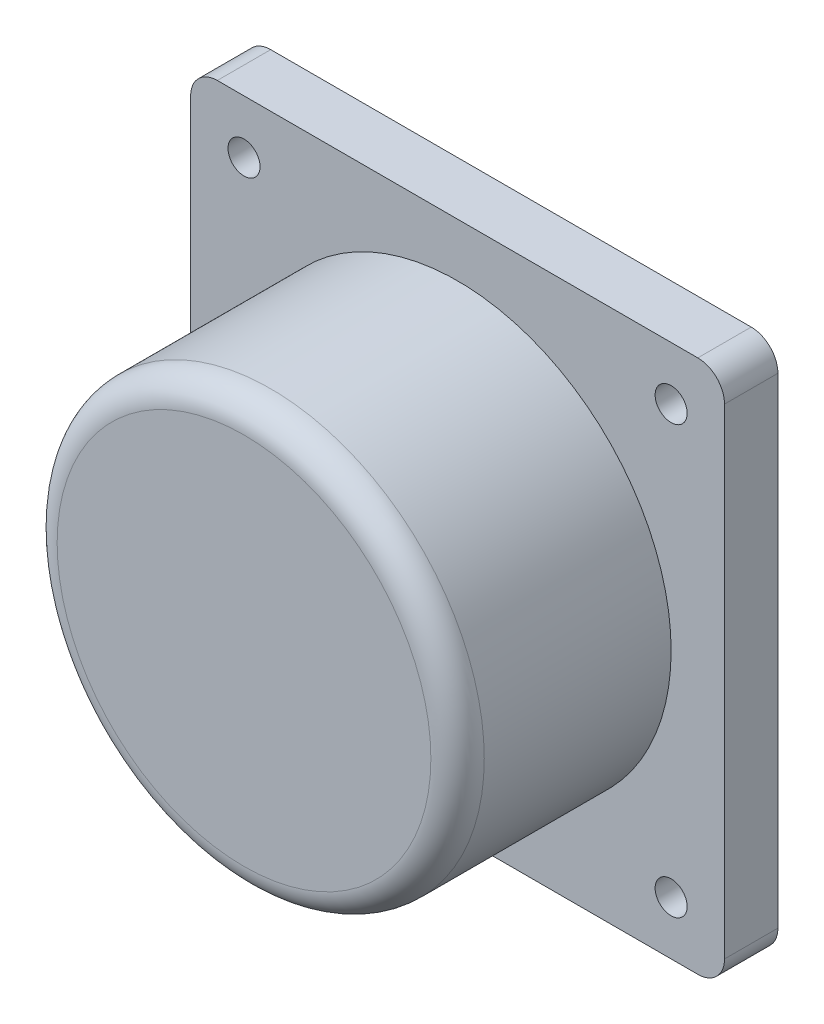
ISO-10303-21;
HEADER;
FILE_DESCRIPTION(('STEP AP214'),'2;1');
FILE_NAME('part.step','',(''),(''),'','','');
FILE_SCHEMA(('AUTOMOTIVE_DESIGN { 1 0 10303 214 1 1 1 1 }'));
ENDSEC;
DATA;
#1=APPLICATION_CONTEXT('core data for automotive mechanical design processes');
#2=APPLICATION_PROTOCOL_DEFINITION('international standard','automotive_design',2000,#1);
#3=PRODUCT_CONTEXT('',#1,'mechanical');
#4=PRODUCT('Part','Part','',(#3));
#5=PRODUCT_RELATED_PRODUCT_CATEGORY('part','',(#4));
#6=PRODUCT_DEFINITION_FORMATION('','',#4);
#7=PRODUCT_DEFINITION_CONTEXT('part definition',#1,'design');
#8=PRODUCT_DEFINITION('design','',#6,#7);
#9=PRODUCT_DEFINITION_SHAPE('','',#8);
#10=(LENGTH_UNIT() NAMED_UNIT(*) SI_UNIT(.MILLI.,.METRE.));
#11=(NAMED_UNIT(*) PLANE_ANGLE_UNIT() SI_UNIT($,.RADIAN.));
#12=(NAMED_UNIT(*) SI_UNIT($,.STERADIAN.) SOLID_ANGLE_UNIT());
#13=UNCERTAINTY_MEASURE_WITH_UNIT(LENGTH_MEASURE(1.E-05),#10,'distance_accuracy_value','');
#14=(GEOMETRIC_REPRESENTATION_CONTEXT(3) GLOBAL_UNCERTAINTY_ASSIGNED_CONTEXT((#13)) GLOBAL_UNIT_ASSIGNED_CONTEXT((#10,
#11,#12)) REPRESENTATION_CONTEXT('',''));
#15=CARTESIAN_POINT('',(0.,0.,0.));
#16=DIRECTION('',(0.,0.,1.));
#17=DIRECTION('',(1.,0.,0.));
#18=AXIS2_PLACEMENT_3D('',#15,#16,#17);
#19=CARTESIAN_POINT('',(0.,0.,10.));
#20=DIRECTION('',(0.,0.,-1.));
#21=DIRECTION('',(-1.,0.,0.));
#22=AXIS2_PLACEMENT_3D('',#19,#20,#21);
#23=PLANE('',#22);
#24=CARTESIAN_POINT('',(0.,0.,10.));
#25=DIRECTION('',(0.,0.,1.));
#26=DIRECTION('',(1.,0.,0.));
#27=AXIS2_PLACEMENT_3D('',#24,#25,#26);
#28=CIRCLE('',#27,40.);
#29=CARTESIAN_POINT('',(40.,0.,10.));
#30=VERTEX_POINT('',#29);
#31=EDGE_CURVE('E145',#30,#30,#28,.T.);
#32=ORIENTED_EDGE('',*,*,#31,.F.);
#33=EDGE_LOOP('',(#32));
#34=FACE_BOUND('',#33,.T.);
#35=DIRECTION('',(0.,1.,0.));
#36=VECTOR('',#35,1.);
#37=CARTESIAN_POINT('',(50.,-50.,10.));
#38=LINE('',#37,#36);
#39=CARTESIAN_POINT('',(50.,-45.,10.));
#40=VERTEX_POINT('',#39);
#41=CARTESIAN_POINT('',(50.,45.,10.));
#42=VERTEX_POINT('',#41);
#43=EDGE_CURVE('E144',#40,#42,#38,.T.);
#44=ORIENTED_EDGE('',*,*,#43,.T.);
#45=CARTESIAN_POINT('',(45.,45.,10.));
#46=DIRECTION('',(0.,0.,-1.));
#47=DIRECTION('',(-1.,0.,0.));
#48=AXIS2_PLACEMENT_3D('',#45,#46,#47);
#49=CIRCLE('',#48,5.);
#50=CARTESIAN_POINT('',(45.,50.,10.));
#51=VERTEX_POINT('',#50);
#52=EDGE_CURVE('E159',#42,#51,#49,.F.);
#53=ORIENTED_EDGE('',*,*,#52,.T.);
#54=DIRECTION('',(-1.,0.,0.));
#55=VECTOR('',#54,1.);
#56=CARTESIAN_POINT('',(-50.,50.,10.));
#57=LINE('',#56,#55);
#58=CARTESIAN_POINT('',(-45.,50.,10.));
#59=VERTEX_POINT('',#58);
#60=EDGE_CURVE('E126',#51,#59,#57,.T.);
#61=ORIENTED_EDGE('',*,*,#60,.T.);
#62=CARTESIAN_POINT('',(-45.,45.,10.));
#63=DIRECTION('',(0.,0.,-1.));
#64=DIRECTION('',(-1.,0.,0.));
#65=AXIS2_PLACEMENT_3D('',#62,#63,#64);
#66=CIRCLE('',#65,5.);
#67=CARTESIAN_POINT('',(-50.,45.,10.));
#68=VERTEX_POINT('',#67);
#69=EDGE_CURVE('E157',#59,#68,#66,.F.);
#70=ORIENTED_EDGE('',*,*,#69,.T.);
#71=DIRECTION('',(0.,-1.,0.));
#72=VECTOR('',#71,1.);
#73=CARTESIAN_POINT('',(-50.,-50.,10.));
#74=LINE('',#73,#72);
#75=CARTESIAN_POINT('',(-50.,-45.,10.));
#76=VERTEX_POINT('',#75);
#77=EDGE_CURVE('E228',#68,#76,#74,.T.);
#78=ORIENTED_EDGE('',*,*,#77,.T.);
#79=CARTESIAN_POINT('',(-45.,-45.,10.));
#80=DIRECTION('',(0.,0.,-1.));
#81=DIRECTION('',(-1.,0.,0.));
#82=AXIS2_PLACEMENT_3D('',#79,#80,#81);
#83=CIRCLE('',#82,5.);
#84=CARTESIAN_POINT('',(-45.,-50.,10.));
#85=VERTEX_POINT('',#84);
#86=EDGE_CURVE('E61',#76,#85,#83,.F.);
#87=ORIENTED_EDGE('',*,*,#86,.T.);
#88=DIRECTION('',(1.,0.,0.));
#89=VECTOR('',#88,1.);
#90=CARTESIAN_POINT('',(-50.,-50.,10.));
#91=LINE('',#90,#89);
#92=CARTESIAN_POINT('',(45.,-50.,10.));
#93=VERTEX_POINT('',#92);
#94=EDGE_CURVE('E222',#85,#93,#91,.T.);
#95=ORIENTED_EDGE('',*,*,#94,.T.);
#96=CARTESIAN_POINT('',(45.,-45.,10.));
#97=DIRECTION('',(0.,0.,-1.));
#98=DIRECTION('',(-1.,0.,0.));
#99=AXIS2_PLACEMENT_3D('',#96,#97,#98);
#100=CIRCLE('',#99,5.);
#101=EDGE_CURVE('E154',#93,#40,#100,.F.);
#102=ORIENTED_EDGE('',*,*,#101,.T.);
#103=EDGE_LOOP('',(#44,#53,#61,#70,#78,#87,#95,#102));
#104=FACE_BOUND('',#103,.T.);
#105=CARTESIAN_POINT('',(40.,40.,10.));
#106=DIRECTION('',(0.,0.,1.));
#107=DIRECTION('',(1.,0.,0.));
#108=AXIS2_PLACEMENT_3D('',#105,#106,#107);
#109=CIRCLE('',#108,3.);
#110=CARTESIAN_POINT('',(43.,40.,10.));
#111=VERTEX_POINT('',#110);
#112=EDGE_CURVE('E139',#111,#111,#109,.T.);
#113=ORIENTED_EDGE('',*,*,#112,.F.);
#114=EDGE_LOOP('',(#113));
#115=FACE_BOUND('',#114,.T.);
#116=CARTESIAN_POINT('',(-40.,40.,10.));
#117=DIRECTION('',(0.,0.,1.));
#118=DIRECTION('',(-1.,0.,0.));
#119=AXIS2_PLACEMENT_3D('',#116,#117,#118);
#120=CIRCLE('',#119,3.00000000000001);
#121=CARTESIAN_POINT('',(-43.,40.,10.));
#122=VERTEX_POINT('',#121);
#123=EDGE_CURVE('E251',#122,#122,#120,.T.);
#124=ORIENTED_EDGE('',*,*,#123,.F.);
#125=EDGE_LOOP('',(#124));
#126=FACE_BOUND('',#125,.T.);
#127=CARTESIAN_POINT('',(-40.,-40.,10.));
#128=DIRECTION('',(0.,0.,1.));
#129=DIRECTION('',(1.,0.,0.));
#130=AXIS2_PLACEMENT_3D('',#127,#128,#129);
#131=CIRCLE('',#130,3.00000000000002);
#132=CARTESIAN_POINT('',(-37.,-40.,10.));
#133=VERTEX_POINT('',#132);
#134=EDGE_CURVE('E245',#133,#133,#131,.T.);
#135=ORIENTED_EDGE('',*,*,#134,.F.);
#136=EDGE_LOOP('',(#135));
#137=FACE_BOUND('',#136,.T.);
#138=CARTESIAN_POINT('',(40.,-40.,10.));
#139=DIRECTION('',(0.,0.,1.));
#140=DIRECTION('',(-1.,0.,0.));
#141=AXIS2_PLACEMENT_3D('',#138,#139,#140);
#142=CIRCLE('',#141,3.00000000000001);
#143=CARTESIAN_POINT('',(37.,-40.,10.));
#144=VERTEX_POINT('',#143);
#145=EDGE_CURVE('E238',#144,#144,#142,.T.);
#146=ORIENTED_EDGE('',*,*,#145,.F.);
#147=EDGE_LOOP('',(#146));
#148=FACE_BOUND('',#147,.T.);
#149=ADVANCED_FACE('F39',(#34,#104,#115,#126,#137,#148),#23,.F.);
#150=CARTESIAN_POINT('',(0.,0.,0.));
#151=DIRECTION('',(0.,0.,-1.));
#152=DIRECTION('',(-1.,0.,0.));
#153=AXIS2_PLACEMENT_3D('',#150,#151,#152);
#154=PLANE('',#153);
#155=CARTESIAN_POINT('',(-40.,-40.,0.));
#156=DIRECTION('',(0.,0.,1.));
#157=DIRECTION('',(1.,0.,0.));
#158=AXIS2_PLACEMENT_3D('',#155,#156,#157);
#159=CIRCLE('',#158,3.00000000000002);
#160=CARTESIAN_POINT('',(-37.,-40.,0.));
#161=VERTEX_POINT('',#160);
#162=EDGE_CURVE('E241',#161,#161,#159,.T.);
#163=ORIENTED_EDGE('',*,*,#162,.T.);
#164=EDGE_LOOP('',(#163));
#165=FACE_BOUND('',#164,.T.);
#166=CARTESIAN_POINT('',(40.,40.,0.));
#167=DIRECTION('',(0.,0.,1.));
#168=DIRECTION('',(1.,0.,0.));
#169=AXIS2_PLACEMENT_3D('',#166,#167,#168);
#170=CIRCLE('',#169,3.);
#171=CARTESIAN_POINT('',(43.,40.,0.));
#172=VERTEX_POINT('',#171);
#173=EDGE_CURVE('E231',#172,#172,#170,.T.);
#174=ORIENTED_EDGE('',*,*,#173,.T.);
#175=EDGE_LOOP('',(#174));
#176=FACE_BOUND('',#175,.T.);
#177=DIRECTION('',(-1.,0.,0.));
#178=VECTOR('',#177,1.);
#179=CARTESIAN_POINT('',(-50.,50.,0.));
#180=LINE('',#179,#178);
#181=CARTESIAN_POINT('',(45.,50.,0.));
#182=VERTEX_POINT('',#181);
#183=CARTESIAN_POINT('',(-45.,50.,0.));
#184=VERTEX_POINT('',#183);
#185=EDGE_CURVE('E123',#182,#184,#180,.T.);
#186=ORIENTED_EDGE('',*,*,#185,.F.);
#187=CARTESIAN_POINT('',(45.,45.,0.));
#188=DIRECTION('',(0.,0.,-1.));
#189=DIRECTION('',(-1.,0.,0.));
#190=AXIS2_PLACEMENT_3D('',#187,#188,#189);
#191=CIRCLE('',#190,5.);
#192=CARTESIAN_POINT('',(50.,45.,0.));
#193=VERTEX_POINT('',#192);
#194=EDGE_CURVE('E106',#182,#193,#191,.T.);
#195=ORIENTED_EDGE('',*,*,#194,.T.);
#196=DIRECTION('',(0.,1.,0.));
#197=VECTOR('',#196,1.);
#198=CARTESIAN_POINT('',(50.,-50.,0.));
#199=LINE('',#198,#197);
#200=CARTESIAN_POINT('',(50.,-45.,0.));
#201=VERTEX_POINT('',#200);
#202=EDGE_CURVE('E134',#201,#193,#199,.T.);
#203=ORIENTED_EDGE('',*,*,#202,.F.);
#204=CARTESIAN_POINT('',(45.,-45.,0.));
#205=DIRECTION('',(0.,0.,-1.));
#206=DIRECTION('',(-1.,0.,0.));
#207=AXIS2_PLACEMENT_3D('',#204,#205,#206);
#208=CIRCLE('',#207,5.);
#209=CARTESIAN_POINT('',(45.,-50.,0.));
#210=VERTEX_POINT('',#209);
#211=EDGE_CURVE('E127',#201,#210,#208,.T.);
#212=ORIENTED_EDGE('',*,*,#211,.T.);
#213=DIRECTION('',(1.,0.,0.));
#214=VECTOR('',#213,1.);
#215=CARTESIAN_POINT('',(-50.,-50.,0.));
#216=LINE('',#215,#214);
#217=CARTESIAN_POINT('',(-45.,-50.,0.));
#218=VERTEX_POINT('',#217);
#219=EDGE_CURVE('E137',#218,#210,#216,.T.);
#220=ORIENTED_EDGE('',*,*,#219,.F.);
#221=CARTESIAN_POINT('',(-45.,-45.,0.));
#222=DIRECTION('',(0.,0.,-1.));
#223=DIRECTION('',(-1.,0.,0.));
#224=AXIS2_PLACEMENT_3D('',#221,#222,#223);
#225=CIRCLE('',#224,5.);
#226=CARTESIAN_POINT('',(-50.,-45.,0.));
#227=VERTEX_POINT('',#226);
#228=EDGE_CURVE('E148',#218,#227,#225,.T.);
#229=ORIENTED_EDGE('',*,*,#228,.T.);
#230=DIRECTION('',(0.,-1.,0.));
#231=VECTOR('',#230,1.);
#232=CARTESIAN_POINT('',(-50.,-50.,0.));
#233=LINE('',#232,#231);
#234=CARTESIAN_POINT('',(-50.,45.,0.));
#235=VERTEX_POINT('',#234);
#236=EDGE_CURVE('E133',#235,#227,#233,.T.);
#237=ORIENTED_EDGE('',*,*,#236,.F.);
#238=CARTESIAN_POINT('',(-45.,45.,0.));
#239=DIRECTION('',(0.,0.,-1.));
#240=DIRECTION('',(-1.,0.,0.));
#241=AXIS2_PLACEMENT_3D('',#238,#239,#240);
#242=CIRCLE('',#241,5.);
#243=EDGE_CURVE('E117',#235,#184,#242,.T.);
#244=ORIENTED_EDGE('',*,*,#243,.T.);
#245=EDGE_LOOP('',(#186,#195,#203,#212,#220,#229,#237,#244));
#246=FACE_BOUND('',#245,.T.);
#247=CARTESIAN_POINT('',(-40.,40.,0.));
#248=DIRECTION('',(0.,0.,1.));
#249=DIRECTION('',(-1.,0.,0.));
#250=AXIS2_PLACEMENT_3D('',#247,#248,#249);
#251=CIRCLE('',#250,3.00000000000001);
#252=CARTESIAN_POINT('',(-43.,40.,0.));
#253=VERTEX_POINT('',#252);
#254=EDGE_CURVE('E248',#253,#253,#251,.T.);
#255=ORIENTED_EDGE('',*,*,#254,.T.);
#256=EDGE_LOOP('',(#255));
#257=FACE_BOUND('',#256,.T.);
#258=CARTESIAN_POINT('',(40.,-40.,0.));
#259=DIRECTION('',(0.,0.,1.));
#260=DIRECTION('',(-1.,0.,0.));
#261=AXIS2_PLACEMENT_3D('',#258,#259,#260);
#262=CIRCLE('',#261,3.00000000000001);
#263=CARTESIAN_POINT('',(37.,-40.,0.));
#264=VERTEX_POINT('',#263);
#265=EDGE_CURVE('E242',#264,#264,#262,.T.);
#266=ORIENTED_EDGE('',*,*,#265,.T.);
#267=EDGE_LOOP('',(#266));
#268=FACE_BOUND('',#267,.T.);
#269=ADVANCED_FACE('F130',(#165,#176,#246,#257,#268),#154,.T.);
#270=CARTESIAN_POINT('',(50.,-50.,10.));
#271=DIRECTION('',(-1.,0.,0.));
#272=DIRECTION('',(0.,0.,1.));
#273=AXIS2_PLACEMENT_3D('',#270,#271,#272);
#274=PLANE('',#273);
#275=ORIENTED_EDGE('',*,*,#202,.T.);
#276=DIRECTION('',(0.,0.,-1.));
#277=VECTOR('',#276,1.);
#278=CARTESIAN_POINT('',(50.,45.,10.));
#279=LINE('',#278,#277);
#280=EDGE_CURVE('E111',#193,#42,#279,.F.);
#281=ORIENTED_EDGE('',*,*,#280,.T.);
#282=ORIENTED_EDGE('',*,*,#43,.F.);
#283=DIRECTION('',(0.,0.,-1.));
#284=VECTOR('',#283,1.);
#285=CARTESIAN_POINT('',(50.,-45.,10.));
#286=LINE('',#285,#284);
#287=EDGE_CURVE('E116',#40,#201,#286,.T.);
#288=ORIENTED_EDGE('',*,*,#287,.T.);
#289=EDGE_LOOP('',(#275,#281,#282,#288));
#290=FACE_BOUND('',#289,.T.);
#291=ADVANCED_FACE('F189',(#290),#274,.F.);
#292=CARTESIAN_POINT('',(-50.,50.,10.));
#293=DIRECTION('',(0.,-1.,0.));
#294=DIRECTION('',(0.,0.,-1.));
#295=AXIS2_PLACEMENT_3D('',#292,#293,#294);
#296=PLANE('',#295);
#297=ORIENTED_EDGE('',*,*,#60,.F.);
#298=DIRECTION('',(0.,0.,-1.));
#299=VECTOR('',#298,1.);
#300=CARTESIAN_POINT('',(45.,50.,10.));
#301=LINE('',#300,#299);
#302=EDGE_CURVE('E110',#51,#182,#301,.T.);
#303=ORIENTED_EDGE('',*,*,#302,.T.);
#304=ORIENTED_EDGE('',*,*,#185,.T.);
#305=DIRECTION('',(0.,0.,-1.));
#306=VECTOR('',#305,1.);
#307=CARTESIAN_POINT('',(-45.,50.,10.));
#308=LINE('',#307,#306);
#309=EDGE_CURVE('E128',#184,#59,#308,.F.);
#310=ORIENTED_EDGE('',*,*,#309,.T.);
#311=EDGE_LOOP('',(#297,#303,#304,#310));
#312=FACE_BOUND('',#311,.T.);
#313=ADVANCED_FACE('F122',(#312),#296,.F.);
#314=CARTESIAN_POINT('',(-50.,-50.,10.));
#315=DIRECTION('',(1.,0.,0.));
#316=DIRECTION('',(0.,0.,-1.));
#317=AXIS2_PLACEMENT_3D('',#314,#315,#316);
#318=PLANE('',#317);
#319=ORIENTED_EDGE('',*,*,#77,.F.);
#320=DIRECTION('',(0.,0.,-1.));
#321=VECTOR('',#320,1.);
#322=CARTESIAN_POINT('',(-50.,45.,10.));
#323=LINE('',#322,#321);
#324=EDGE_CURVE('E163',#68,#235,#323,.T.);
#325=ORIENTED_EDGE('',*,*,#324,.T.);
#326=ORIENTED_EDGE('',*,*,#236,.T.);
#327=DIRECTION('',(0.,0.,-1.));
#328=VECTOR('',#327,1.);
#329=CARTESIAN_POINT('',(-50.,-45.,10.));
#330=LINE('',#329,#328);
#331=EDGE_CURVE('E161',#227,#76,#330,.F.);
#332=ORIENTED_EDGE('',*,*,#331,.T.);
#333=EDGE_LOOP('',(#319,#325,#326,#332));
#334=FACE_BOUND('',#333,.T.);
#335=ADVANCED_FACE('F200',(#334),#318,.F.);
#336=CARTESIAN_POINT('',(-50.,-50.,10.));
#337=DIRECTION('',(0.,1.,0.));
#338=DIRECTION('',(0.,0.,1.));
#339=AXIS2_PLACEMENT_3D('',#336,#337,#338);
#340=PLANE('',#339);
#341=ORIENTED_EDGE('',*,*,#94,.F.);
#342=DIRECTION('',(0.,0.,-1.));
#343=VECTOR('',#342,1.);
#344=CARTESIAN_POINT('',(-45.,-50.,10.));
#345=LINE('',#344,#343);
#346=EDGE_CURVE('E167',#85,#218,#345,.T.);
#347=ORIENTED_EDGE('',*,*,#346,.T.);
#348=ORIENTED_EDGE('',*,*,#219,.T.);
#349=DIRECTION('',(0.,0.,-1.));
#350=VECTOR('',#349,1.);
#351=CARTESIAN_POINT('',(45.,-50.,10.));
#352=LINE('',#351,#350);
#353=EDGE_CURVE('E54',#210,#93,#352,.F.);
#354=ORIENTED_EDGE('',*,*,#353,.T.);
#355=EDGE_LOOP('',(#341,#347,#348,#354));
#356=FACE_BOUND('',#355,.T.);
#357=ADVANCED_FACE('F197',(#356),#340,.F.);
#358=CARTESIAN_POINT('',(40.,40.,10.));
#359=DIRECTION('',(0.,0.,-1.));
#360=DIRECTION('',(-1.,0.,0.));
#361=AXIS2_PLACEMENT_3D('',#358,#359,#360);
#362=CYLINDRICAL_SURFACE('',#361,3.);
#363=ORIENTED_EDGE('',*,*,#112,.T.);
#364=EDGE_LOOP('',(#363));
#365=FACE_BOUND('',#364,.T.);
#366=ORIENTED_EDGE('',*,*,#173,.F.);
#367=EDGE_LOOP('',(#366));
#368=FACE_BOUND('',#367,.T.);
#369=ADVANCED_FACE('F194',(#365,#368),#362,.F.);
#370=CARTESIAN_POINT('',(-40.,40.,10.));
#371=DIRECTION('',(0.,0.,-1.));
#372=DIRECTION('',(-1.,0.,0.));
#373=AXIS2_PLACEMENT_3D('',#370,#371,#372);
#374=CYLINDRICAL_SURFACE('',#373,3.00000000000001);
#375=ORIENTED_EDGE('',*,*,#123,.T.);
#376=EDGE_LOOP('',(#375));
#377=FACE_BOUND('',#376,.T.);
#378=ORIENTED_EDGE('',*,*,#254,.F.);
#379=EDGE_LOOP('',(#378));
#380=FACE_BOUND('',#379,.T.);
#381=ADVANCED_FACE('F263',(#377,#380),#374,.F.);
#382=CARTESIAN_POINT('',(-40.,-40.,10.));
#383=DIRECTION('',(0.,0.,-1.));
#384=DIRECTION('',(-1.,0.,0.));
#385=AXIS2_PLACEMENT_3D('',#382,#383,#384);
#386=CYLINDRICAL_SURFACE('',#385,3.00000000000002);
#387=ORIENTED_EDGE('',*,*,#134,.T.);
#388=EDGE_LOOP('',(#387));
#389=FACE_BOUND('',#388,.T.);
#390=ORIENTED_EDGE('',*,*,#162,.F.);
#391=EDGE_LOOP('',(#390));
#392=FACE_BOUND('',#391,.T.);
#393=ADVANCED_FACE('F267',(#389,#392),#386,.F.);
#394=CARTESIAN_POINT('',(40.,-40.,10.));
#395=DIRECTION('',(0.,0.,-1.));
#396=DIRECTION('',(-1.,0.,0.));
#397=AXIS2_PLACEMENT_3D('',#394,#395,#396);
#398=CYLINDRICAL_SURFACE('',#397,3.00000000000001);
#399=ORIENTED_EDGE('',*,*,#145,.T.);
#400=EDGE_LOOP('',(#399));
#401=FACE_BOUND('',#400,.T.);
#402=ORIENTED_EDGE('',*,*,#265,.F.);
#403=EDGE_LOOP('',(#402));
#404=FACE_BOUND('',#403,.T.);
#405=ADVANCED_FACE('F272',(#401,#404),#398,.F.);
#406=CARTESIAN_POINT('',(0.,0.,50.));
#407=DIRECTION('',(0.,0.,-1.));
#408=DIRECTION('',(-1.,0.,0.));
#409=AXIS2_PLACEMENT_3D('',#406,#407,#408);
#410=CYLINDRICAL_SURFACE('',#409,40.);
#411=CARTESIAN_POINT('',(0.,0.,45.));
#412=DIRECTION('',(0.,0.,1.));
#413=DIRECTION('',(1.,0.,0.));
#414=AXIS2_PLACEMENT_3D('',#411,#412,#413);
#415=CIRCLE('',#414,40.);
#416=CARTESIAN_POINT('',(40.,0.,45.));
#417=VERTEX_POINT('',#416);
#418=EDGE_CURVE('E11',#417,#417,#415,.F.);
#419=ORIENTED_EDGE('',*,*,#418,.T.);
#420=EDGE_LOOP('',(#419));
#421=FACE_BOUND('',#420,.T.);
#422=ORIENTED_EDGE('',*,*,#31,.T.);
#423=EDGE_LOOP('',(#422));
#424=FACE_BOUND('',#423,.T.);
#425=ADVANCED_FACE('F279',(#421,#424),#410,.T.);
#426=CARTESIAN_POINT('',(0.,0.,50.));
#427=DIRECTION('',(0.,0.,1.));
#428=DIRECTION('',(1.,0.,0.));
#429=AXIS2_PLACEMENT_3D('',#426,#427,#428);
#430=PLANE('',#429);
#431=CARTESIAN_POINT('',(0.,0.,50.));
#432=DIRECTION('',(0.,0.,1.));
#433=DIRECTION('',(1.,0.,0.));
#434=AXIS2_PLACEMENT_3D('',#431,#432,#433);
#435=CIRCLE('',#434,35.);
#436=CARTESIAN_POINT('',(35.,0.,50.));
#437=VERTEX_POINT('',#436);
#438=EDGE_CURVE('E47',#437,#437,#435,.T.);
#439=ORIENTED_EDGE('',*,*,#438,.T.);
#440=EDGE_LOOP('',(#439));
#441=FACE_BOUND('',#440,.T.);
#442=ADVANCED_FACE('F172',(#441),#430,.T.);
#443=CARTESIAN_POINT('',(45.,45.,10.));
#444=DIRECTION('',(0.,0.,-1.));
#445=DIRECTION('',(-1.,0.,0.));
#446=AXIS2_PLACEMENT_3D('',#443,#444,#445);
#447=CYLINDRICAL_SURFACE('',#446,5.);
#448=ORIENTED_EDGE('',*,*,#52,.F.);
#449=ORIENTED_EDGE('',*,*,#280,.F.);
#450=ORIENTED_EDGE('',*,*,#194,.F.);
#451=ORIENTED_EDGE('',*,*,#302,.F.);
#452=EDGE_LOOP('',(#448,#449,#450,#451));
#453=FACE_BOUND('',#452,.T.);
#454=ADVANCED_FACE('F109',(#453),#447,.T.);
#455=CARTESIAN_POINT('',(-45.,45.,10.));
#456=DIRECTION('',(0.,0.,-1.));
#457=DIRECTION('',(-1.,0.,0.));
#458=AXIS2_PLACEMENT_3D('',#455,#456,#457);
#459=CYLINDRICAL_SURFACE('',#458,5.);
#460=ORIENTED_EDGE('',*,*,#69,.F.);
#461=ORIENTED_EDGE('',*,*,#309,.F.);
#462=ORIENTED_EDGE('',*,*,#243,.F.);
#463=ORIENTED_EDGE('',*,*,#324,.F.);
#464=EDGE_LOOP('',(#460,#461,#462,#463));
#465=FACE_BOUND('',#464,.T.);
#466=ADVANCED_FACE('F211',(#465),#459,.T.);
#467=CARTESIAN_POINT('',(-45.,-45.,10.));
#468=DIRECTION('',(0.,0.,-1.));
#469=DIRECTION('',(-1.,0.,0.));
#470=AXIS2_PLACEMENT_3D('',#467,#468,#469);
#471=CYLINDRICAL_SURFACE('',#470,5.);
#472=ORIENTED_EDGE('',*,*,#86,.F.);
#473=ORIENTED_EDGE('',*,*,#331,.F.);
#474=ORIENTED_EDGE('',*,*,#228,.F.);
#475=ORIENTED_EDGE('',*,*,#346,.F.);
#476=EDGE_LOOP('',(#472,#473,#474,#475));
#477=FACE_BOUND('',#476,.T.);
#478=ADVANCED_FACE('F180',(#477),#471,.T.);
#479=CARTESIAN_POINT('',(45.,-45.,10.));
#480=DIRECTION('',(0.,0.,-1.));
#481=DIRECTION('',(-1.,0.,0.));
#482=AXIS2_PLACEMENT_3D('',#479,#480,#481);
#483=CYLINDRICAL_SURFACE('',#482,5.);
#484=ORIENTED_EDGE('',*,*,#101,.F.);
#485=ORIENTED_EDGE('',*,*,#353,.F.);
#486=ORIENTED_EDGE('',*,*,#211,.F.);
#487=ORIENTED_EDGE('',*,*,#287,.F.);
#488=EDGE_LOOP('',(#484,#485,#486,#487));
#489=FACE_BOUND('',#488,.T.);
#490=ADVANCED_FACE('F175',(#489),#483,.T.);
#491=CARTESIAN_POINT('',(0.,0.,45.));
#492=DIRECTION('',(0.,0.,1.));
#493=DIRECTION('',(1.,0.,0.));
#494=AXIS2_PLACEMENT_3D('',#491,#492,#493);
#495=TOROIDAL_SURFACE('',#494,35.,5.);
#496=ORIENTED_EDGE('',*,*,#418,.F.);
#497=EDGE_LOOP('',(#496));
#498=FACE_BOUND('',#497,.T.);
#499=ORIENTED_EDGE('',*,*,#438,.F.);
#500=EDGE_LOOP('',(#499));
#501=FACE_BOUND('',#500,.T.);
#502=ADVANCED_FACE('F41',(#498,#501),#495,.T.);
#503=CLOSED_SHELL('',(#149,#269,#291,#313,#335,#357,#369,#381,#393,#405,#425,#442,#454,#466,
#478,#490,#502));
#504=MANIFOLD_SOLID_BREP('B2',#503);
#505=ADVANCED_BREP_SHAPE_REPRESENTATION('',(#18,#504),#14);
#506=SHAPE_DEFINITION_REPRESENTATION(#9,#505);
ENDSEC;
END-ISO-10303-21;
